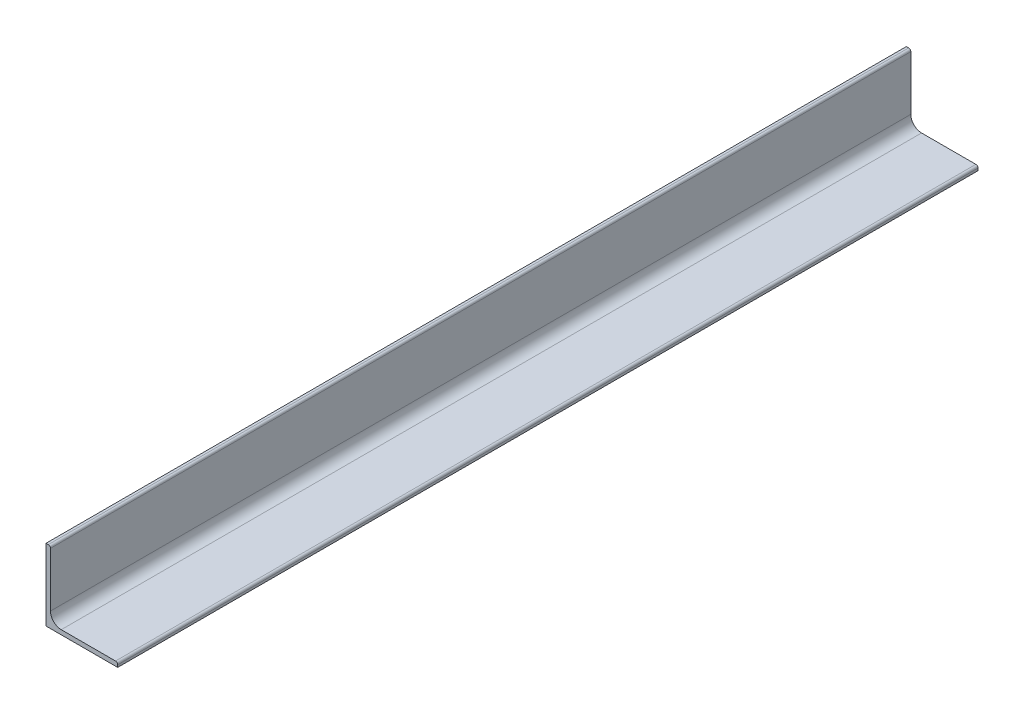
ISO-10303-21;
HEADER;
FILE_DESCRIPTION(('STEP AP214'),'2;1');
FILE_NAME('part.step','',(''),(''),'','','');
FILE_SCHEMA(('AUTOMOTIVE_DESIGN { 1 0 10303 214 1 1 1 1 }'));
ENDSEC;
DATA;
#1=APPLICATION_CONTEXT('core data for automotive mechanical design processes');
#2=APPLICATION_PROTOCOL_DEFINITION('international standard','automotive_design',2000,#1);
#3=PRODUCT_CONTEXT('',#1,'mechanical');
#4=PRODUCT('Part','Part','',(#3));
#5=PRODUCT_RELATED_PRODUCT_CATEGORY('part','',(#4));
#6=PRODUCT_DEFINITION_FORMATION('','',#4);
#7=PRODUCT_DEFINITION_CONTEXT('part definition',#1,'design');
#8=PRODUCT_DEFINITION('design','',#6,#7);
#9=PRODUCT_DEFINITION_SHAPE('','',#8);
#10=(LENGTH_UNIT() NAMED_UNIT(*) SI_UNIT(.MILLI.,.METRE.));
#11=(NAMED_UNIT(*) PLANE_ANGLE_UNIT() SI_UNIT($,.RADIAN.));
#12=(NAMED_UNIT(*) SI_UNIT($,.STERADIAN.) SOLID_ANGLE_UNIT());
#13=UNCERTAINTY_MEASURE_WITH_UNIT(LENGTH_MEASURE(1.E-05),#10,'distance_accuracy_value','');
#14=(GEOMETRIC_REPRESENTATION_CONTEXT(3) GLOBAL_UNCERTAINTY_ASSIGNED_CONTEXT((#13)) GLOBAL_UNIT_ASSIGNED_CONTEXT((#10,
#11,#12)) REPRESENTATION_CONTEXT('',''));
#15=CARTESIAN_POINT('',(0.,0.,0.));
#16=DIRECTION('',(0.,0.,1.));
#17=DIRECTION('',(1.,0.,0.));
#18=AXIS2_PLACEMENT_3D('',#15,#16,#17);
#19=CARTESIAN_POINT('',(15.2399999999999,15.2400000000004,1219.2));
#20=DIRECTION('',(0.,0.,-1.));
#21=DIRECTION('',(-1.,0.,0.));
#22=AXIS2_PLACEMENT_3D('',#19,#20,#21);
#23=CYLINDRICAL_SURFACE('',#22,15.24);
#24=CARTESIAN_POINT('',(15.2399999999999,15.2400000000004,-2.05391259555654E-12));
#25=DIRECTION('',(0.,0.,-1.));
#26=DIRECTION('',(1.,0.,0.));
#27=AXIS2_PLACEMENT_3D('',#24,#25,#26);
#28=CIRCLE('',#27,15.24);
#29=CARTESIAN_POINT('',(15.2399999999999,0.,0.));
#30=VERTEX_POINT('',#29);
#31=CARTESIAN_POINT('',(0.,15.2400000000004,0.));
#32=VERTEX_POINT('',#31);
#33=EDGE_CURVE('E140',#30,#32,#28,.T.);
#34=ORIENTED_EDGE('',*,*,#33,.T.);
#35=DIRECTION('',(0.,0.,-1.));
#36=VECTOR('',#35,1.);
#37=CARTESIAN_POINT('',(0.,15.2400000000004,1219.2));
#38=LINE('',#37,#36);
#39=CARTESIAN_POINT('',(0.,15.2400000000004,1219.2));
#40=VERTEX_POINT('',#39);
#41=EDGE_CURVE('E11',#40,#32,#38,.T.);
#42=ORIENTED_EDGE('',*,*,#41,.F.);
#43=CARTESIAN_POINT('',(15.2399999999999,15.2400000000004,1219.2));
#44=DIRECTION('',(0.,0.,-1.));
#45=DIRECTION('',(1.,0.,0.));
#46=AXIS2_PLACEMENT_3D('',#43,#44,#45);
#47=CIRCLE('',#46,15.24);
#48=CARTESIAN_POINT('',(15.2399999999999,0.,1219.2));
#49=VERTEX_POINT('',#48);
#50=EDGE_CURVE('E158',#49,#40,#47,.T.);
#51=ORIENTED_EDGE('',*,*,#50,.F.);
#52=DIRECTION('',(0.,0.,-1.));
#53=VECTOR('',#52,1.);
#54=CARTESIAN_POINT('',(15.2399999999999,0.,1219.2));
#55=LINE('',#54,#53);
#56=EDGE_CURVE('E136',#49,#30,#55,.T.);
#57=ORIENTED_EDGE('',*,*,#56,.T.);
#58=EDGE_LOOP('',(#34,#42,#51,#57));
#59=FACE_BOUND('',#58,.T.);
#60=ADVANCED_FACE('F32',(#59),#23,.F.);
#61=CARTESIAN_POINT('',(0.,15.2400000000004,1219.2));
#62=DIRECTION('',(-1.,0.,0.));
#63=DIRECTION('',(0.,-1.,0.));
#64=AXIS2_PLACEMENT_3D('',#61,#62,#63);
#65=PLANE('',#64);
#66=DIRECTION('',(0.,1.,0.));
#67=VECTOR('',#66,1.);
#68=CARTESIAN_POINT('',(0.,15.2400000000004,0.));
#69=LINE('',#68,#67);
#70=CARTESIAN_POINT('',(0.,92.2020000000003,2.16493489801906E-12));
#71=VERTEX_POINT('',#70);
#72=EDGE_CURVE('E143',#32,#71,#69,.T.);
#73=ORIENTED_EDGE('',*,*,#72,.T.);
#74=DIRECTION('',(0.,0.,-1.));
#75=VECTOR('',#74,1.);
#76=CARTESIAN_POINT('',(0.,92.2020000000003,1219.2));
#77=LINE('',#76,#75);
#78=CARTESIAN_POINT('',(0.,92.2020000000003,1219.2));
#79=VERTEX_POINT('',#78);
#80=EDGE_CURVE('E40',#79,#71,#77,.T.);
#81=ORIENTED_EDGE('',*,*,#80,.F.);
#82=DIRECTION('',(0.,1.,0.));
#83=VECTOR('',#82,1.);
#84=CARTESIAN_POINT('',(0.,15.2400000000004,1219.2));
#85=LINE('',#84,#83);
#86=EDGE_CURVE('E97',#40,#79,#85,.T.);
#87=ORIENTED_EDGE('',*,*,#86,.F.);
#88=ORIENTED_EDGE('',*,*,#41,.T.);
#89=EDGE_LOOP('',(#73,#81,#87,#88));
#90=FACE_BOUND('',#89,.T.);
#91=ADVANCED_FACE('F207',(#90),#65,.F.);
#92=CARTESIAN_POINT('',(-3.04800000000016,92.2020000000003,1219.2));
#93=DIRECTION('',(0.,0.,-1.));
#94=DIRECTION('',(-1.,0.,0.));
#95=AXIS2_PLACEMENT_3D('',#92,#93,#94);
#96=CYLINDRICAL_SURFACE('',#95,3.048);
#97=CARTESIAN_POINT('',(-3.04800000000016,92.2020000000003,2.16493489801906E-12));
#98=DIRECTION('',(0.,0.,1.));
#99=DIRECTION('',(1.,0.,0.));
#100=AXIS2_PLACEMENT_3D('',#97,#98,#99);
#101=CIRCLE('',#100,3.048);
#102=CARTESIAN_POINT('',(-3.04800000000016,95.2500000000001,2.16493489801906E-12));
#103=VERTEX_POINT('',#102);
#104=EDGE_CURVE('E145',#71,#103,#101,.T.);
#105=ORIENTED_EDGE('',*,*,#104,.T.);
#106=DIRECTION('',(0.,0.,-1.));
#107=VECTOR('',#106,1.);
#108=CARTESIAN_POINT('',(-3.04800000000016,95.2500000000001,1219.2));
#109=LINE('',#108,#107);
#110=CARTESIAN_POINT('',(-3.04800000000016,95.2500000000001,1219.2));
#111=VERTEX_POINT('',#110);
#112=EDGE_CURVE('E171',#111,#103,#109,.T.);
#113=ORIENTED_EDGE('',*,*,#112,.F.);
#114=CARTESIAN_POINT('',(-3.04800000000016,92.2020000000003,1219.2));
#115=DIRECTION('',(0.,0.,1.));
#116=DIRECTION('',(1.,0.,0.));
#117=AXIS2_PLACEMENT_3D('',#114,#115,#116);
#118=CIRCLE('',#117,3.048);
#119=EDGE_CURVE('E179',#79,#111,#118,.T.);
#120=ORIENTED_EDGE('',*,*,#119,.F.);
#121=ORIENTED_EDGE('',*,*,#80,.T.);
#122=EDGE_LOOP('',(#105,#113,#120,#121));
#123=FACE_BOUND('',#122,.T.);
#124=ADVANCED_FACE('F177',(#123),#96,.T.);
#125=CARTESIAN_POINT('',(-3.04800000000016,95.2500000000001,1219.2));
#126=DIRECTION('',(0.,-1.,0.));
#127=DIRECTION('',(0.,0.,-1.));
#128=AXIS2_PLACEMENT_3D('',#125,#126,#127);
#129=PLANE('',#128);
#130=DIRECTION('',(-1.,0.,0.));
#131=VECTOR('',#130,1.);
#132=CARTESIAN_POINT('',(-3.04800000000016,95.2500000000001,2.16493489801906E-12));
#133=LINE('',#132,#131);
#134=CARTESIAN_POINT('',(-6.34999999999986,95.2500000000001,2.16493489801906E-12));
#135=VERTEX_POINT('',#134);
#136=EDGE_CURVE('E147',#103,#135,#133,.T.);
#137=ORIENTED_EDGE('',*,*,#136,.T.);
#138=DIRECTION('',(0.,0.,-1.));
#139=VECTOR('',#138,1.);
#140=CARTESIAN_POINT('',(-6.34999999999986,95.2500000000001,1219.2));
#141=LINE('',#140,#139);
#142=CARTESIAN_POINT('',(-6.34999999999986,95.2500000000001,1219.2));
#143=VERTEX_POINT('',#142);
#144=EDGE_CURVE('E168',#143,#135,#141,.T.);
#145=ORIENTED_EDGE('',*,*,#144,.F.);
#146=DIRECTION('',(-1.,0.,0.));
#147=VECTOR('',#146,1.);
#148=CARTESIAN_POINT('',(-3.04800000000016,95.2500000000001,1219.2));
#149=LINE('',#148,#147);
#150=EDGE_CURVE('E197',#111,#143,#149,.T.);
#151=ORIENTED_EDGE('',*,*,#150,.F.);
#152=ORIENTED_EDGE('',*,*,#112,.T.);
#153=EDGE_LOOP('',(#137,#145,#151,#152));
#154=FACE_BOUND('',#153,.T.);
#155=ADVANCED_FACE('F188',(#154),#129,.F.);
#156=CARTESIAN_POINT('',(-6.34999999999986,95.2500000000001,1219.2));
#157=DIRECTION('',(1.,0.,0.));
#158=DIRECTION('',(0.,1.,0.));
#159=AXIS2_PLACEMENT_3D('',#156,#157,#158);
#160=PLANE('',#159);
#161=DIRECTION('',(0.,-1.,0.));
#162=VECTOR('',#161,1.);
#163=CARTESIAN_POINT('',(-6.34999999999986,95.2500000000001,2.16493489801906E-12));
#164=LINE('',#163,#162);
#165=CARTESIAN_POINT('',(-6.34999999999986,-5.33400000000039,0.));
#166=VERTEX_POINT('',#165);
#167=EDGE_CURVE('E149',#135,#166,#164,.T.);
#168=ORIENTED_EDGE('',*,*,#167,.T.);
#169=DIRECTION('',(0.,0.,-1.));
#170=VECTOR('',#169,1.);
#171=CARTESIAN_POINT('',(-6.34999999999986,-5.33399999999951,1219.2));
#172=LINE('',#171,#170);
#173=CARTESIAN_POINT('',(-6.34999999999986,-5.33399999999951,1219.2));
#174=VERTEX_POINT('',#173);
#175=EDGE_CURVE('E165',#174,#166,#172,.T.);
#176=ORIENTED_EDGE('',*,*,#175,.F.);
#177=DIRECTION('',(0.,-1.,0.));
#178=VECTOR('',#177,1.);
#179=CARTESIAN_POINT('',(-6.34999999999986,95.2500000000001,1219.2));
#180=LINE('',#179,#178);
#181=EDGE_CURVE('E194',#143,#174,#180,.T.);
#182=ORIENTED_EDGE('',*,*,#181,.F.);
#183=ORIENTED_EDGE('',*,*,#144,.T.);
#184=EDGE_LOOP('',(#168,#176,#182,#183));
#185=FACE_BOUND('',#184,.T.);
#186=ADVANCED_FACE('F192',(#185),#160,.F.);
#187=CARTESIAN_POINT('',(-5.33399999999995,-5.33399999999951,1219.2));
#188=DIRECTION('',(0.,0.,-1.));
#189=DIRECTION('',(-1.,0.,0.));
#190=AXIS2_PLACEMENT_3D('',#187,#188,#189);
#191=CYLINDRICAL_SURFACE('',#190,1.016);
#192=CARTESIAN_POINT('',(-5.33399999999995,-5.33400000000039,0.));
#193=DIRECTION('',(0.,0.,1.));
#194=DIRECTION('',(1.,0.,0.));
#195=AXIS2_PLACEMENT_3D('',#192,#193,#194);
#196=CIRCLE('',#195,1.016);
#197=CARTESIAN_POINT('',(-5.33399999999995,-6.3500000000003,0.));
#198=VERTEX_POINT('',#197);
#199=EDGE_CURVE('E151',#166,#198,#196,.T.);
#200=ORIENTED_EDGE('',*,*,#199,.T.);
#201=DIRECTION('',(0.,0.,-1.));
#202=VECTOR('',#201,1.);
#203=CARTESIAN_POINT('',(-5.33399999999995,-6.34999999999941,1219.2));
#204=LINE('',#203,#202);
#205=CARTESIAN_POINT('',(-5.33399999999995,-6.34999999999941,1219.2));
#206=VERTEX_POINT('',#205);
#207=EDGE_CURVE('E162',#206,#198,#204,.T.);
#208=ORIENTED_EDGE('',*,*,#207,.F.);
#209=CARTESIAN_POINT('',(-5.33399999999995,-5.33399999999951,1219.2));
#210=DIRECTION('',(0.,0.,1.));
#211=DIRECTION('',(1.,0.,0.));
#212=AXIS2_PLACEMENT_3D('',#209,#210,#211);
#213=CIRCLE('',#212,1.016);
#214=EDGE_CURVE('E196',#174,#206,#213,.T.);
#215=ORIENTED_EDGE('',*,*,#214,.F.);
#216=ORIENTED_EDGE('',*,*,#175,.T.);
#217=EDGE_LOOP('',(#200,#208,#215,#216));
#218=FACE_BOUND('',#217,.T.);
#219=ADVANCED_FACE('F219',(#218),#191,.T.);
#220=CARTESIAN_POINT('',(-5.33399999999995,-6.34999999999941,1219.2));
#221=DIRECTION('',(0.,1.,0.));
#222=DIRECTION('',(-1.,0.,0.));
#223=AXIS2_PLACEMENT_3D('',#220,#221,#222);
#224=PLANE('',#223);
#225=DIRECTION('',(1.,0.,0.));
#226=VECTOR('',#225,1.);
#227=CARTESIAN_POINT('',(-5.33399999999995,-6.3500000000003,0.));
#228=LINE('',#227,#226);
#229=CARTESIAN_POINT('',(95.2500000000001,-6.3500000000003,-2.1094237467878E-12));
#230=VERTEX_POINT('',#229);
#231=EDGE_CURVE('E153',#198,#230,#228,.T.);
#232=ORIENTED_EDGE('',*,*,#231,.T.);
#233=DIRECTION('',(0.,0.,-1.));
#234=VECTOR('',#233,1.);
#235=CARTESIAN_POINT('',(95.2500000000001,-6.34999999999941,1219.2));
#236=LINE('',#235,#234);
#237=CARTESIAN_POINT('',(95.2500000000001,-6.34999999999941,1219.2));
#238=VERTEX_POINT('',#237);
#239=EDGE_CURVE('E131',#238,#230,#236,.T.);
#240=ORIENTED_EDGE('',*,*,#239,.F.);
#241=DIRECTION('',(1.,0.,0.));
#242=VECTOR('',#241,1.);
#243=CARTESIAN_POINT('',(-5.33399999999995,-6.34999999999941,1219.2));
#244=LINE('',#243,#242);
#245=EDGE_CURVE('E122',#206,#238,#244,.T.);
#246=ORIENTED_EDGE('',*,*,#245,.F.);
#247=ORIENTED_EDGE('',*,*,#207,.T.);
#248=EDGE_LOOP('',(#232,#240,#246,#247));
#249=FACE_BOUND('',#248,.T.);
#250=ADVANCED_FACE('F222',(#249),#224,.F.);
#251=CARTESIAN_POINT('',(95.2500000000001,-6.34999999999941,1219.2));
#252=DIRECTION('',(-1.,0.,0.));
#253=DIRECTION('',(0.,-1.,0.));
#254=AXIS2_PLACEMENT_3D('',#251,#252,#253);
#255=PLANE('',#254);
#256=DIRECTION('',(0.,1.,0.));
#257=VECTOR('',#256,1.);
#258=CARTESIAN_POINT('',(95.2500000000001,-6.3500000000003,-2.1094237467878E-12));
#259=LINE('',#258,#257);
#260=CARTESIAN_POINT('',(95.2500000000001,-3.04799999999972,-2.1094237467878E-12));
#261=VERTEX_POINT('',#260);
#262=EDGE_CURVE('E130',#230,#261,#259,.T.);
#263=ORIENTED_EDGE('',*,*,#262,.T.);
#264=DIRECTION('',(0.,0.,-1.));
#265=VECTOR('',#264,1.);
#266=CARTESIAN_POINT('',(95.2500000000001,-3.04799999999972,1219.2));
#267=LINE('',#266,#265);
#268=CARTESIAN_POINT('',(95.2500000000001,-3.04799999999972,1219.2));
#269=VERTEX_POINT('',#268);
#270=EDGE_CURVE('E127',#269,#261,#267,.T.);
#271=ORIENTED_EDGE('',*,*,#270,.F.);
#272=DIRECTION('',(0.,1.,0.));
#273=VECTOR('',#272,1.);
#274=CARTESIAN_POINT('',(95.2500000000001,-6.34999999999941,1219.2));
#275=LINE('',#274,#273);
#276=EDGE_CURVE('E116',#238,#269,#275,.T.);
#277=ORIENTED_EDGE('',*,*,#276,.F.);
#278=ORIENTED_EDGE('',*,*,#239,.T.);
#279=EDGE_LOOP('',(#263,#271,#277,#278));
#280=FACE_BOUND('',#279,.T.);
#281=ADVANCED_FACE('F128',(#280),#255,.F.);
#282=CARTESIAN_POINT('',(92.2019999999999,-3.04799999999972,1219.2));
#283=DIRECTION('',(0.,0.,-1.));
#284=DIRECTION('',(-1.,0.,0.));
#285=AXIS2_PLACEMENT_3D('',#282,#283,#284);
#286=CYLINDRICAL_SURFACE('',#285,3.048);
#287=CARTESIAN_POINT('',(92.2019999999999,-3.04799999999972,-2.1094237467878E-12));
#288=DIRECTION('',(0.,0.,1.));
#289=DIRECTION('',(1.,0.,0.));
#290=AXIS2_PLACEMENT_3D('',#287,#288,#289);
#291=CIRCLE('',#290,3.048);
#292=CARTESIAN_POINT('',(92.2019999999999,0.,-2.1094237467878E-12));
#293=VERTEX_POINT('',#292);
#294=EDGE_CURVE('E83',#261,#293,#291,.T.);
#295=ORIENTED_EDGE('',*,*,#294,.T.);
#296=DIRECTION('',(0.,0.,-1.));
#297=VECTOR('',#296,1.);
#298=CARTESIAN_POINT('',(92.2019999999999,0.,1219.2));
#299=LINE('',#298,#297);
#300=CARTESIAN_POINT('',(92.2019999999999,0.,1219.2));
#301=VERTEX_POINT('',#300);
#302=EDGE_CURVE('E132',#301,#293,#299,.T.);
#303=ORIENTED_EDGE('',*,*,#302,.F.);
#304=CARTESIAN_POINT('',(92.2019999999999,-3.04799999999972,1219.2));
#305=DIRECTION('',(0.,0.,1.));
#306=DIRECTION('',(1.,0.,0.));
#307=AXIS2_PLACEMENT_3D('',#304,#305,#306);
#308=CIRCLE('',#307,3.048);
#309=EDGE_CURVE('E120',#269,#301,#308,.T.);
#310=ORIENTED_EDGE('',*,*,#309,.F.);
#311=ORIENTED_EDGE('',*,*,#270,.T.);
#312=EDGE_LOOP('',(#295,#303,#310,#311));
#313=FACE_BOUND('',#312,.T.);
#314=ADVANCED_FACE('F134',(#313),#286,.T.);
#315=CARTESIAN_POINT('',(92.2019999999999,0.,1219.2));
#316=DIRECTION('',(0.,-1.,0.));
#317=DIRECTION('',(1.,0.,0.));
#318=AXIS2_PLACEMENT_3D('',#315,#316,#317);
#319=PLANE('',#318);
#320=DIRECTION('',(-1.,0.,0.));
#321=VECTOR('',#320,1.);
#322=CARTESIAN_POINT('',(92.2019999999999,0.,-2.1094237467878E-12));
#323=LINE('',#322,#321);
#324=EDGE_CURVE('E89',#293,#30,#323,.T.);
#325=ORIENTED_EDGE('',*,*,#324,.T.);
#326=ORIENTED_EDGE('',*,*,#56,.F.);
#327=DIRECTION('',(-1.,0.,0.));
#328=VECTOR('',#327,1.);
#329=CARTESIAN_POINT('',(92.2019999999999,0.,1219.2));
#330=LINE('',#329,#328);
#331=EDGE_CURVE('E48',#301,#49,#330,.T.);
#332=ORIENTED_EDGE('',*,*,#331,.F.);
#333=ORIENTED_EDGE('',*,*,#302,.T.);
#334=EDGE_LOOP('',(#325,#326,#332,#333));
#335=FACE_BOUND('',#334,.T.);
#336=ADVANCED_FACE('F231',(#335),#319,.F.);
#337=CARTESIAN_POINT('',(15.2399999999999,15.2400000000004,1219.2));
#338=DIRECTION('',(0.,0.,1.));
#339=DIRECTION('',(1.,0.,0.));
#340=AXIS2_PLACEMENT_3D('',#337,#338,#339);
#341=PLANE('',#340);
#342=ORIENTED_EDGE('',*,*,#50,.T.);
#343=ORIENTED_EDGE('',*,*,#86,.T.);
#344=ORIENTED_EDGE('',*,*,#119,.T.);
#345=ORIENTED_EDGE('',*,*,#150,.T.);
#346=ORIENTED_EDGE('',*,*,#181,.T.);
#347=ORIENTED_EDGE('',*,*,#214,.T.);
#348=ORIENTED_EDGE('',*,*,#245,.T.);
#349=ORIENTED_EDGE('',*,*,#276,.T.);
#350=ORIENTED_EDGE('',*,*,#309,.T.);
#351=ORIENTED_EDGE('',*,*,#331,.T.);
#352=EDGE_LOOP('',(#342,#343,#344,#345,#346,#347,#348,#349,#350,#351));
#353=FACE_BOUND('',#352,.T.);
#354=ADVANCED_FACE('F118',(#353),#341,.T.);
#355=CARTESIAN_POINT('',(15.2399999999999,15.2400000000004,-2.05391259555654E-12));
#356=DIRECTION('',(0.,0.,1.));
#357=DIRECTION('',(1.,0.,0.));
#358=AXIS2_PLACEMENT_3D('',#355,#356,#357);
#359=PLANE('',#358);
#360=ORIENTED_EDGE('',*,*,#33,.F.);
#361=ORIENTED_EDGE('',*,*,#324,.F.);
#362=ORIENTED_EDGE('',*,*,#294,.F.);
#363=ORIENTED_EDGE('',*,*,#262,.F.);
#364=ORIENTED_EDGE('',*,*,#231,.F.);
#365=ORIENTED_EDGE('',*,*,#199,.F.);
#366=ORIENTED_EDGE('',*,*,#167,.F.);
#367=ORIENTED_EDGE('',*,*,#136,.F.);
#368=ORIENTED_EDGE('',*,*,#104,.F.);
#369=ORIENTED_EDGE('',*,*,#72,.F.);
#370=EDGE_LOOP('',(#360,#361,#362,#363,#364,#365,#366,#367,#368,#369));
#371=FACE_BOUND('',#370,.T.);
#372=ADVANCED_FACE('F183',(#371),#359,.F.);
#373=CLOSED_SHELL('',(#60,#91,#124,#155,#186,#219,#250,#281,#314,#336,#354,#372));
#374=MANIFOLD_SOLID_BREP('B2',#373);
#375=ADVANCED_BREP_SHAPE_REPRESENTATION('',(#18,#374),#14);
#376=SHAPE_DEFINITION_REPRESENTATION(#9,#375);
ENDSEC;
END-ISO-10303-21;
